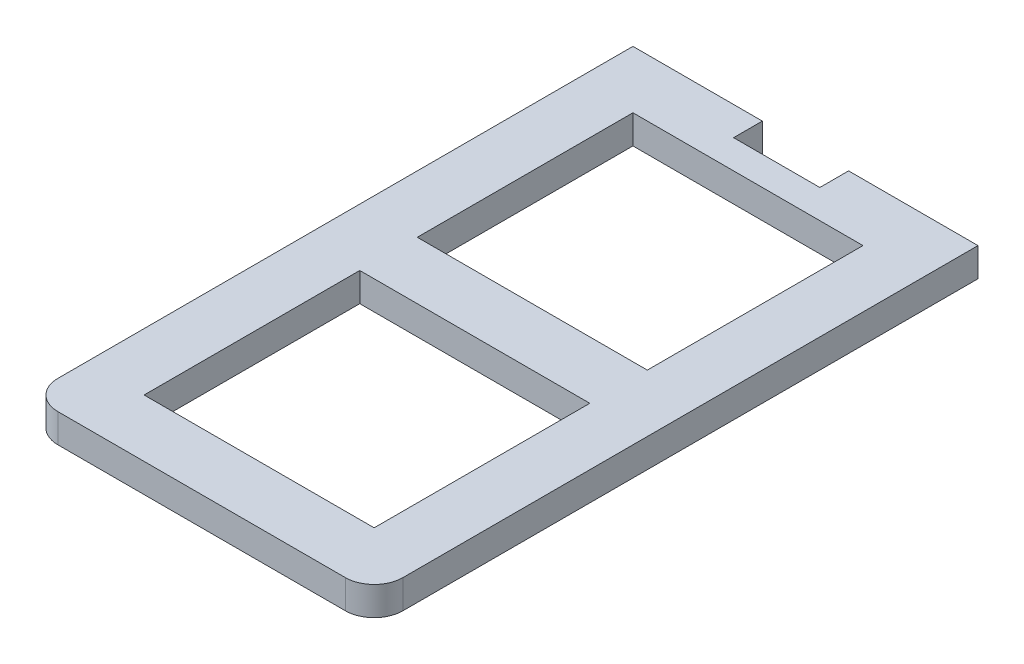
ISO-10303-21;
HEADER;
FILE_DESCRIPTION(('STEP AP214'),'2;1');
FILE_NAME('part.step','',(''),(''),'','','');
FILE_SCHEMA(('AUTOMOTIVE_DESIGN { 1 0 10303 214 1 1 1 1 }'));
ENDSEC;
DATA;
#1=APPLICATION_CONTEXT('core data for automotive mechanical design processes');
#2=APPLICATION_PROTOCOL_DEFINITION('international standard','automotive_design',2000,#1);
#3=PRODUCT_CONTEXT('',#1,'mechanical');
#4=PRODUCT('Part','Part','',(#3));
#5=PRODUCT_RELATED_PRODUCT_CATEGORY('part','',(#4));
#6=PRODUCT_DEFINITION_FORMATION('','',#4);
#7=PRODUCT_DEFINITION_CONTEXT('part definition',#1,'design');
#8=PRODUCT_DEFINITION('design','',#6,#7);
#9=PRODUCT_DEFINITION_SHAPE('','',#8);
#10=(LENGTH_UNIT() NAMED_UNIT(*) SI_UNIT(.MILLI.,.METRE.));
#11=(NAMED_UNIT(*) PLANE_ANGLE_UNIT() SI_UNIT($,.RADIAN.));
#12=(NAMED_UNIT(*) SI_UNIT($,.STERADIAN.) SOLID_ANGLE_UNIT());
#13=UNCERTAINTY_MEASURE_WITH_UNIT(LENGTH_MEASURE(1.E-05),#10,'distance_accuracy_value','');
#14=(GEOMETRIC_REPRESENTATION_CONTEXT(3) GLOBAL_UNCERTAINTY_ASSIGNED_CONTEXT((#13)) GLOBAL_UNIT_ASSIGNED_CONTEXT((#10,
#11,#12)) REPRESENTATION_CONTEXT('',''));
#15=CARTESIAN_POINT('',(0.,0.,0.));
#16=DIRECTION('',(0.,0.,1.));
#17=DIRECTION('',(1.,0.,0.));
#18=AXIS2_PLACEMENT_3D('',#15,#16,#17);
#19=CARTESIAN_POINT('',(0.,0.,0.));
#20=DIRECTION('',(0.,0.,-1.));
#21=DIRECTION('',(-1.,0.,0.));
#22=AXIS2_PLACEMENT_3D('',#19,#20,#21);
#23=PLANE('',#22);
#24=DIRECTION('',(0.,1.,0.));
#25=VECTOR('',#24,1.);
#26=CARTESIAN_POINT('',(-7.5,0.,0.));
#27=LINE('',#26,#25);
#28=CARTESIAN_POINT('',(-7.5,-2.5,0.));
#29=VERTEX_POINT('',#28);
#30=CARTESIAN_POINT('',(-7.5,2.5,0.));
#31=VERTEX_POINT('',#30);
#32=EDGE_CURVE('E11',#29,#31,#27,.T.);
#33=ORIENTED_EDGE('',*,*,#32,.F.);
#34=DIRECTION('',(1.,0.,0.));
#35=VECTOR('',#34,1.);
#36=CARTESIAN_POINT('',(-30.,-2.5,0.));
#37=LINE('',#36,#35);
#38=CARTESIAN_POINT('',(-30.,-2.5,0.));
#39=VERTEX_POINT('',#38);
#40=EDGE_CURVE('E257',#39,#29,#37,.T.);
#41=ORIENTED_EDGE('',*,*,#40,.F.);
#42=DIRECTION('',(0.,-1.,0.));
#43=VECTOR('',#42,1.);
#44=CARTESIAN_POINT('',(-30.,-2.5,0.));
#45=LINE('',#44,#43);
#46=CARTESIAN_POINT('',(-30.,2.5,0.));
#47=VERTEX_POINT('',#46);
#48=EDGE_CURVE('E267',#47,#39,#45,.T.);
#49=ORIENTED_EDGE('',*,*,#48,.F.);
#50=DIRECTION('',(-1.,0.,0.));
#51=VECTOR('',#50,1.);
#52=CARTESIAN_POINT('',(-30.,2.5,0.));
#53=LINE('',#52,#51);
#54=EDGE_CURVE('E263',#31,#47,#53,.T.);
#55=ORIENTED_EDGE('',*,*,#54,.F.);
#56=EDGE_LOOP('',(#33,#41,#49,#55));
#57=FACE_BOUND('',#56,.T.);
#58=ADVANCED_FACE('F37',(#57),#23,.T.);
#59=CARTESIAN_POINT('',(-30.,2.5,105.));
#60=DIRECTION('',(0.,-1.,0.));
#61=DIRECTION('',(0.,0.,-1.));
#62=AXIS2_PLACEMENT_3D('',#59,#60,#61);
#63=PLANE('',#62);
#64=DIRECTION('',(1.,0.,0.));
#65=VECTOR('',#64,1.);
#66=CARTESIAN_POINT('',(-30.,2.5,95.));
#67=LINE('',#66,#65);
#68=CARTESIAN_POINT('',(-20.,2.5,95.));
#69=VERTEX_POINT('',#68);
#70=CARTESIAN_POINT('',(20.,2.5,95.));
#71=VERTEX_POINT('',#70);
#72=EDGE_CURVE('E247',#69,#71,#67,.T.);
#73=ORIENTED_EDGE('',*,*,#72,.F.);
#74=DIRECTION('',(0.,0.,-1.));
#75=VECTOR('',#74,1.);
#76=CARTESIAN_POINT('',(-20.,2.5,105.));
#77=LINE('',#76,#75);
#78=CARTESIAN_POINT('',(-20.,2.5,57.5));
#79=VERTEX_POINT('',#78);
#80=EDGE_CURVE('E249',#69,#79,#77,.T.);
#81=ORIENTED_EDGE('',*,*,#80,.T.);
#82=DIRECTION('',(1.,0.,0.));
#83=VECTOR('',#82,1.);
#84=CARTESIAN_POINT('',(-30.,2.5,57.5));
#85=LINE('',#84,#83);
#86=CARTESIAN_POINT('',(20.,2.5,57.5));
#87=VERTEX_POINT('',#86);
#88=EDGE_CURVE('E241',#79,#87,#85,.T.);
#89=ORIENTED_EDGE('',*,*,#88,.T.);
#90=DIRECTION('',(0.,0.,-1.));
#91=VECTOR('',#90,1.);
#92=CARTESIAN_POINT('',(20.,2.5,105.));
#93=LINE('',#92,#91);
#94=EDGE_CURVE('E244',#71,#87,#93,.T.);
#95=ORIENTED_EDGE('',*,*,#94,.F.);
#96=EDGE_LOOP('',(#73,#81,#89,#95));
#97=FACE_BOUND('',#96,.T.);
#98=DIRECTION('',(-1.,0.,0.));
#99=VECTOR('',#98,1.);
#100=CARTESIAN_POINT('',(-30.,2.5,5.));
#101=LINE('',#100,#99);
#102=CARTESIAN_POINT('',(7.5,2.5,5.));
#103=VERTEX_POINT('',#102);
#104=CARTESIAN_POINT('',(-7.5,2.5,5.));
#105=VERTEX_POINT('',#104);
#106=EDGE_CURVE('E169',#103,#105,#101,.T.);
#107=ORIENTED_EDGE('',*,*,#106,.T.);
#108=DIRECTION('',(0.,0.,-1.));
#109=VECTOR('',#108,1.);
#110=CARTESIAN_POINT('',(-7.5,2.5,105.));
#111=LINE('',#110,#109);
#112=EDGE_CURVE('E186',#105,#31,#111,.T.);
#113=ORIENTED_EDGE('',*,*,#112,.T.);
#114=ORIENTED_EDGE('',*,*,#54,.T.);
#115=DIRECTION('',(0.,0.,-1.));
#116=VECTOR('',#115,1.);
#117=CARTESIAN_POINT('',(-30.,2.5,105.));
#118=LINE('',#117,#116);
#119=CARTESIAN_POINT('',(-30.,2.5,100.));
#120=VERTEX_POINT('',#119);
#121=EDGE_CURVE('E276',#120,#47,#118,.T.);
#122=ORIENTED_EDGE('',*,*,#121,.F.);
#123=CARTESIAN_POINT('',(-25.,2.5,100.));
#124=DIRECTION('',(0.,-1.,0.));
#125=DIRECTION('',(0.,0.,-1.));
#126=AXIS2_PLACEMENT_3D('',#123,#124,#125);
#127=CIRCLE('',#126,5.);
#128=CARTESIAN_POINT('',(-25.,2.5,105.));
#129=VERTEX_POINT('',#128);
#130=EDGE_CURVE('E287',#120,#129,#127,.F.);
#131=ORIENTED_EDGE('',*,*,#130,.T.);
#132=DIRECTION('',(-1.,0.,0.));
#133=VECTOR('',#132,1.);
#134=CARTESIAN_POINT('',(-30.,2.5,105.));
#135=LINE('',#134,#133);
#136=CARTESIAN_POINT('',(25.,2.5,105.));
#137=VERTEX_POINT('',#136);
#138=EDGE_CURVE('E253',#137,#129,#135,.T.);
#139=ORIENTED_EDGE('',*,*,#138,.F.);
#140=CARTESIAN_POINT('',(25.,2.5,100.));
#141=DIRECTION('',(0.,-1.,0.));
#142=DIRECTION('',(0.,0.,-1.));
#143=AXIS2_PLACEMENT_3D('',#140,#141,#142);
#144=CIRCLE('',#143,5.);
#145=CARTESIAN_POINT('',(30.,2.5,100.));
#146=VERTEX_POINT('',#145);
#147=EDGE_CURVE('E289',#137,#146,#144,.F.);
#148=ORIENTED_EDGE('',*,*,#147,.T.);
#149=DIRECTION('',(0.,0.,-1.));
#150=VECTOR('',#149,1.);
#151=CARTESIAN_POINT('',(30.,2.5,105.));
#152=LINE('',#151,#150);
#153=CARTESIAN_POINT('',(30.,2.5,0.));
#154=VERTEX_POINT('',#153);
#155=EDGE_CURVE('E279',#146,#154,#152,.T.);
#156=ORIENTED_EDGE('',*,*,#155,.T.);
#157=CARTESIAN_POINT('',(7.5,2.5,0.));
#158=VERTEX_POINT('',#157);
#159=EDGE_CURVE('E264',#154,#158,#53,.T.);
#160=ORIENTED_EDGE('',*,*,#159,.T.);
#161=DIRECTION('',(0.,0.,1.));
#162=VECTOR('',#161,1.);
#163=CARTESIAN_POINT('',(7.5,2.5,105.));
#164=LINE('',#163,#162);
#165=EDGE_CURVE('E52',#158,#103,#164,.T.);
#166=ORIENTED_EDGE('',*,*,#165,.T.);
#167=EDGE_LOOP('',(#107,#113,#114,#122,#131,#139,#148,#156,#160,#166));
#168=FACE_BOUND('',#167,.T.);
#169=DIRECTION('',(1.,0.,0.));
#170=VECTOR('',#169,1.);
#171=CARTESIAN_POINT('',(-30.,2.5,47.5));
#172=LINE('',#171,#170);
#173=CARTESIAN_POINT('',(-20.,2.5,47.5));
#174=VERTEX_POINT('',#173);
#175=CARTESIAN_POINT('',(20.,2.5,47.5));
#176=VERTEX_POINT('',#175);
#177=EDGE_CURVE('E239',#174,#176,#172,.T.);
#178=ORIENTED_EDGE('',*,*,#177,.F.);
#179=DIRECTION('',(0.,0.,-1.));
#180=VECTOR('',#179,1.);
#181=CARTESIAN_POINT('',(-20.,2.5,105.));
#182=LINE('',#181,#180);
#183=CARTESIAN_POINT('',(-20.,2.5,9.99999999999998));
#184=VERTEX_POINT('',#183);
#185=EDGE_CURVE('E206',#174,#184,#182,.T.);
#186=ORIENTED_EDGE('',*,*,#185,.T.);
#187=DIRECTION('',(1.,0.,0.));
#188=VECTOR('',#187,1.);
#189=CARTESIAN_POINT('',(-30.,2.5,9.99999999999998));
#190=LINE('',#189,#188);
#191=CARTESIAN_POINT('',(20.,2.5,9.99999999999998));
#192=VERTEX_POINT('',#191);
#193=EDGE_CURVE('E234',#184,#192,#190,.T.);
#194=ORIENTED_EDGE('',*,*,#193,.T.);
#195=DIRECTION('',(0.,0.,-1.));
#196=VECTOR('',#195,1.);
#197=CARTESIAN_POINT('',(20.,2.5,105.));
#198=LINE('',#197,#196);
#199=EDGE_CURVE('E237',#176,#192,#198,.T.);
#200=ORIENTED_EDGE('',*,*,#199,.F.);
#201=EDGE_LOOP('',(#178,#186,#194,#200));
#202=FACE_BOUND('',#201,.T.);
#203=ADVANCED_FACE('F305',(#97,#168,#202),#63,.F.);
#204=CARTESIAN_POINT('',(-30.,-2.5,105.));
#205=DIRECTION('',(0.,1.,0.));
#206=DIRECTION('',(0.,0.,1.));
#207=AXIS2_PLACEMENT_3D('',#204,#205,#206);
#208=PLANE('',#207);
#209=DIRECTION('',(1.,0.,0.));
#210=VECTOR('',#209,1.);
#211=CARTESIAN_POINT('',(0.,-2.5,57.5));
#212=LINE('',#211,#210);
#213=CARTESIAN_POINT('',(-20.,-2.5,57.5));
#214=VERTEX_POINT('',#213);
#215=CARTESIAN_POINT('',(20.,-2.5,57.5));
#216=VERTEX_POINT('',#215);
#217=EDGE_CURVE('E193',#214,#216,#212,.T.);
#218=ORIENTED_EDGE('',*,*,#217,.F.);
#219=DIRECTION('',(0.,0.,-1.));
#220=VECTOR('',#219,1.);
#221=CARTESIAN_POINT('',(-20.,-2.5,0.));
#222=LINE('',#221,#220);
#223=CARTESIAN_POINT('',(-20.,-2.5,95.));
#224=VERTEX_POINT('',#223);
#225=EDGE_CURVE('E191',#224,#214,#222,.T.);
#226=ORIENTED_EDGE('',*,*,#225,.F.);
#227=DIRECTION('',(1.,0.,0.));
#228=VECTOR('',#227,1.);
#229=CARTESIAN_POINT('',(0.,-2.5,95.));
#230=LINE('',#229,#228);
#231=CARTESIAN_POINT('',(20.,-2.5,95.));
#232=VERTEX_POINT('',#231);
#233=EDGE_CURVE('E200',#224,#232,#230,.T.);
#234=ORIENTED_EDGE('',*,*,#233,.T.);
#235=DIRECTION('',(0.,0.,-1.));
#236=VECTOR('',#235,1.);
#237=CARTESIAN_POINT('',(20.,-2.5,0.));
#238=LINE('',#237,#236);
#239=EDGE_CURVE('E197',#232,#216,#238,.T.);
#240=ORIENTED_EDGE('',*,*,#239,.T.);
#241=EDGE_LOOP('',(#218,#226,#234,#240));
#242=FACE_BOUND('',#241,.T.);
#243=ORIENTED_EDGE('',*,*,#40,.T.);
#244=DIRECTION('',(0.,0.,-1.));
#245=VECTOR('',#244,1.);
#246=CARTESIAN_POINT('',(-7.5,-2.5,-5.));
#247=LINE('',#246,#245);
#248=CARTESIAN_POINT('',(-7.5,-2.5,5.));
#249=VERTEX_POINT('',#248);
#250=EDGE_CURVE('E176',#249,#29,#247,.T.);
#251=ORIENTED_EDGE('',*,*,#250,.F.);
#252=DIRECTION('',(-1.,0.,0.));
#253=VECTOR('',#252,1.);
#254=CARTESIAN_POINT('',(7.5,-2.5,5.));
#255=LINE('',#254,#253);
#256=CARTESIAN_POINT('',(7.5,-2.5,5.));
#257=VERTEX_POINT('',#256);
#258=EDGE_CURVE('E166',#257,#249,#255,.T.);
#259=ORIENTED_EDGE('',*,*,#258,.F.);
#260=DIRECTION('',(0.,0.,1.));
#261=VECTOR('',#260,1.);
#262=CARTESIAN_POINT('',(7.5,-2.5,-5.));
#263=LINE('',#262,#261);
#264=CARTESIAN_POINT('',(7.5,-2.5,0.));
#265=VERTEX_POINT('',#264);
#266=EDGE_CURVE('E173',#265,#257,#263,.T.);
#267=ORIENTED_EDGE('',*,*,#266,.F.);
#268=CARTESIAN_POINT('',(30.,-2.5,0.));
#269=VERTEX_POINT('',#268);
#270=EDGE_CURVE('E270',#265,#269,#37,.T.);
#271=ORIENTED_EDGE('',*,*,#270,.T.);
#272=DIRECTION('',(0.,0.,-1.));
#273=VECTOR('',#272,1.);
#274=CARTESIAN_POINT('',(30.,-2.5,105.));
#275=LINE('',#274,#273);
#276=CARTESIAN_POINT('',(30.,-2.5,100.));
#277=VERTEX_POINT('',#276);
#278=EDGE_CURVE('E260',#277,#269,#275,.T.);
#279=ORIENTED_EDGE('',*,*,#278,.F.);
#280=CARTESIAN_POINT('',(25.,-2.5,100.));
#281=DIRECTION('',(0.,1.,0.));
#282=DIRECTION('',(0.,0.,1.));
#283=AXIS2_PLACEMENT_3D('',#280,#281,#282);
#284=CIRCLE('',#283,5.);
#285=CARTESIAN_POINT('',(25.,-2.5,105.));
#286=VERTEX_POINT('',#285);
#287=EDGE_CURVE('E294',#277,#286,#284,.F.);
#288=ORIENTED_EDGE('',*,*,#287,.T.);
#289=DIRECTION('',(1.,0.,0.));
#290=VECTOR('',#289,1.);
#291=CARTESIAN_POINT('',(-30.,-2.5,105.));
#292=LINE('',#291,#290);
#293=CARTESIAN_POINT('',(-25.,-2.5,105.));
#294=VERTEX_POINT('',#293);
#295=EDGE_CURVE('E256',#294,#286,#292,.T.);
#296=ORIENTED_EDGE('',*,*,#295,.F.);
#297=CARTESIAN_POINT('',(-25.,-2.5,100.));
#298=DIRECTION('',(0.,1.,0.));
#299=DIRECTION('',(0.,0.,1.));
#300=AXIS2_PLACEMENT_3D('',#297,#298,#299);
#301=CIRCLE('',#300,5.);
#302=CARTESIAN_POINT('',(-30.,-2.5,100.));
#303=VERTEX_POINT('',#302);
#304=EDGE_CURVE('E60',#294,#303,#301,.F.);
#305=ORIENTED_EDGE('',*,*,#304,.T.);
#306=DIRECTION('',(0.,0.,-1.));
#307=VECTOR('',#306,1.);
#308=CARTESIAN_POINT('',(-30.,-2.5,105.));
#309=LINE('',#308,#307);
#310=EDGE_CURVE('E274',#303,#39,#309,.T.);
#311=ORIENTED_EDGE('',*,*,#310,.T.);
#312=EDGE_LOOP('',(#243,#251,#259,#267,#271,#279,#288,#296,#305,#311));
#313=FACE_BOUND('',#312,.T.);
#314=DIRECTION('',(1.,0.,0.));
#315=VECTOR('',#314,1.);
#316=CARTESIAN_POINT('',(0.,-2.5,47.5));
#317=LINE('',#316,#315);
#318=CARTESIAN_POINT('',(-20.,-2.5,47.5));
#319=VERTEX_POINT('',#318);
#320=CARTESIAN_POINT('',(20.,-2.5,47.5));
#321=VERTEX_POINT('',#320);
#322=EDGE_CURVE('E190',#319,#321,#317,.T.);
#323=ORIENTED_EDGE('',*,*,#322,.T.);
#324=DIRECTION('',(0.,0.,-1.));
#325=VECTOR('',#324,1.);
#326=CARTESIAN_POINT('',(20.,-2.5,0.));
#327=LINE('',#326,#325);
#328=CARTESIAN_POINT('',(20.,-2.5,9.99999999999998));
#329=VERTEX_POINT('',#328);
#330=EDGE_CURVE('E221',#321,#329,#327,.T.);
#331=ORIENTED_EDGE('',*,*,#330,.T.);
#332=DIRECTION('',(1.,0.,0.));
#333=VECTOR('',#332,1.);
#334=CARTESIAN_POINT('',(0.,-2.5,9.99999999999998));
#335=LINE('',#334,#333);
#336=CARTESIAN_POINT('',(-20.,-2.5,9.99999999999997));
#337=VERTEX_POINT('',#336);
#338=EDGE_CURVE('E218',#337,#329,#335,.T.);
#339=ORIENTED_EDGE('',*,*,#338,.F.);
#340=DIRECTION('',(0.,0.,-1.));
#341=VECTOR('',#340,1.);
#342=CARTESIAN_POINT('',(-20.,-2.5,0.));
#343=LINE('',#342,#341);
#344=EDGE_CURVE('E215',#319,#337,#343,.T.);
#345=ORIENTED_EDGE('',*,*,#344,.F.);
#346=EDGE_LOOP('',(#323,#331,#339,#345));
#347=FACE_BOUND('',#346,.T.);
#348=ADVANCED_FACE('F179',(#242,#313,#347),#208,.F.);
#349=CARTESIAN_POINT('',(30.,-2.5,105.));
#350=DIRECTION('',(-1.,0.,0.));
#351=DIRECTION('',(0.,0.,1.));
#352=AXIS2_PLACEMENT_3D('',#349,#350,#351);
#353=PLANE('',#352);
#354=ORIENTED_EDGE('',*,*,#155,.F.);
#355=DIRECTION('',(0.,1.,0.));
#356=VECTOR('',#355,1.);
#357=CARTESIAN_POINT('',(30.,-2.5,100.));
#358=LINE('',#357,#356);
#359=EDGE_CURVE('E291',#146,#277,#358,.F.);
#360=ORIENTED_EDGE('',*,*,#359,.T.);
#361=ORIENTED_EDGE('',*,*,#278,.T.);
#362=DIRECTION('',(0.,1.,0.));
#363=VECTOR('',#362,1.);
#364=CARTESIAN_POINT('',(30.,-2.5,0.));
#365=LINE('',#364,#363);
#366=EDGE_CURVE('E252',#269,#154,#365,.T.);
#367=ORIENTED_EDGE('',*,*,#366,.T.);
#368=EDGE_LOOP('',(#354,#360,#361,#367));
#369=FACE_BOUND('',#368,.T.);
#370=ADVANCED_FACE('F321',(#369),#353,.F.);
#371=CARTESIAN_POINT('',(-30.,-2.5,105.));
#372=DIRECTION('',(1.,0.,0.));
#373=DIRECTION('',(0.,0.,-1.));
#374=AXIS2_PLACEMENT_3D('',#371,#372,#373);
#375=PLANE('',#374);
#376=ORIENTED_EDGE('',*,*,#310,.F.);
#377=DIRECTION('',(0.,-1.,0.));
#378=VECTOR('',#377,1.);
#379=CARTESIAN_POINT('',(-30.,-2.5,100.));
#380=LINE('',#379,#378);
#381=EDGE_CURVE('E296',#303,#120,#380,.F.);
#382=ORIENTED_EDGE('',*,*,#381,.T.);
#383=ORIENTED_EDGE('',*,*,#121,.T.);
#384=ORIENTED_EDGE('',*,*,#48,.T.);
#385=EDGE_LOOP('',(#376,#382,#383,#384));
#386=FACE_BOUND('',#385,.T.);
#387=ADVANCED_FACE('F300',(#386),#375,.F.);
#388=CARTESIAN_POINT('',(0.,0.,105.));
#389=DIRECTION('',(0.,0.,-1.));
#390=DIRECTION('',(-1.,0.,0.));
#391=AXIS2_PLACEMENT_3D('',#388,#389,#390);
#392=PLANE('',#391);
#393=ORIENTED_EDGE('',*,*,#295,.T.);
#394=DIRECTION('',(0.,1.,0.));
#395=VECTOR('',#394,1.);
#396=CARTESIAN_POINT('',(25.,0.,105.));
#397=LINE('',#396,#395);
#398=EDGE_CURVE('E284',#286,#137,#397,.T.);
#399=ORIENTED_EDGE('',*,*,#398,.T.);
#400=ORIENTED_EDGE('',*,*,#138,.T.);
#401=DIRECTION('',(0.,-1.,0.));
#402=VECTOR('',#401,1.);
#403=CARTESIAN_POINT('',(-25.,0.,105.));
#404=LINE('',#403,#402);
#405=EDGE_CURVE('E281',#129,#294,#404,.T.);
#406=ORIENTED_EDGE('',*,*,#405,.T.);
#407=EDGE_LOOP('',(#393,#399,#400,#406));
#408=FACE_BOUND('',#407,.T.);
#409=ADVANCED_FACE('F311',(#408),#392,.F.);
#410=DIRECTION('',(0.,-1.,0.));
#411=VECTOR('',#410,1.);
#412=CARTESIAN_POINT('',(7.5,0.,0.));
#413=LINE('',#412,#411);
#414=EDGE_CURVE('E45',#158,#265,#413,.T.);
#415=ORIENTED_EDGE('',*,*,#414,.F.);
#416=ORIENTED_EDGE('',*,*,#159,.F.);
#417=ORIENTED_EDGE('',*,*,#366,.F.);
#418=ORIENTED_EDGE('',*,*,#270,.F.);
#419=EDGE_LOOP('',(#415,#416,#417,#418));
#420=FACE_BOUND('',#419,.T.);
#421=ADVANCED_FACE('F324',(#420),#23,.T.);
#422=CARTESIAN_POINT('',(0.,102.5,47.5));
#423=DIRECTION('',(0.,0.,-1.));
#424=DIRECTION('',(-1.,0.,0.));
#425=AXIS2_PLACEMENT_3D('',#422,#423,#424);
#426=PLANE('',#425);
#427=ORIENTED_EDGE('',*,*,#177,.T.);
#428=DIRECTION('',(0.,-1.,0.));
#429=VECTOR('',#428,1.);
#430=CARTESIAN_POINT('',(20.,102.5,47.5));
#431=LINE('',#430,#429);
#432=EDGE_CURVE('E194',#176,#321,#431,.T.);
#433=ORIENTED_EDGE('',*,*,#432,.T.);
#434=ORIENTED_EDGE('',*,*,#322,.F.);
#435=DIRECTION('',(0.,-1.,0.));
#436=VECTOR('',#435,1.);
#437=CARTESIAN_POINT('',(-20.,102.5,47.5));
#438=LINE('',#437,#436);
#439=EDGE_CURVE('E224',#174,#319,#438,.T.);
#440=ORIENTED_EDGE('',*,*,#439,.F.);
#441=EDGE_LOOP('',(#427,#433,#434,#440));
#442=FACE_BOUND('',#441,.T.);
#443=ADVANCED_FACE('F350',(#442),#426,.T.);
#444=CARTESIAN_POINT('',(20.,102.5,0.));
#445=DIRECTION('',(-1.,0.,0.));
#446=DIRECTION('',(0.,0.,1.));
#447=AXIS2_PLACEMENT_3D('',#444,#445,#446);
#448=PLANE('',#447);
#449=ORIENTED_EDGE('',*,*,#199,.T.);
#450=DIRECTION('',(0.,-1.,0.));
#451=VECTOR('',#450,1.);
#452=CARTESIAN_POINT('',(20.,102.5,9.99999999999998));
#453=LINE('',#452,#451);
#454=EDGE_CURVE('E226',#192,#329,#453,.T.);
#455=ORIENTED_EDGE('',*,*,#454,.T.);
#456=ORIENTED_EDGE('',*,*,#330,.F.);
#457=ORIENTED_EDGE('',*,*,#432,.F.);
#458=EDGE_LOOP('',(#449,#455,#456,#457));
#459=FACE_BOUND('',#458,.T.);
#460=ADVANCED_FACE('F356',(#459),#448,.T.);
#461=CARTESIAN_POINT('',(0.,102.5,9.99999999999998));
#462=DIRECTION('',(0.,0.,-1.));
#463=DIRECTION('',(-1.,0.,0.));
#464=AXIS2_PLACEMENT_3D('',#461,#462,#463);
#465=PLANE('',#464);
#466=DIRECTION('',(0.,-1.,0.));
#467=VECTOR('',#466,1.);
#468=CARTESIAN_POINT('',(-20.,102.5,9.99999999999997));
#469=LINE('',#468,#467);
#470=EDGE_CURVE('E228',#184,#337,#469,.T.);
#471=ORIENTED_EDGE('',*,*,#470,.T.);
#472=ORIENTED_EDGE('',*,*,#338,.T.);
#473=ORIENTED_EDGE('',*,*,#454,.F.);
#474=ORIENTED_EDGE('',*,*,#193,.F.);
#475=EDGE_LOOP('',(#471,#472,#473,#474));
#476=FACE_BOUND('',#475,.T.);
#477=ADVANCED_FACE('F370',(#476),#465,.F.);
#478=CARTESIAN_POINT('',(-20.,102.5,0.));
#479=DIRECTION('',(-1.,0.,0.));
#480=DIRECTION('',(0.,0.,1.));
#481=AXIS2_PLACEMENT_3D('',#478,#479,#480);
#482=PLANE('',#481);
#483=ORIENTED_EDGE('',*,*,#439,.T.);
#484=ORIENTED_EDGE('',*,*,#344,.T.);
#485=ORIENTED_EDGE('',*,*,#470,.F.);
#486=ORIENTED_EDGE('',*,*,#185,.F.);
#487=EDGE_LOOP('',(#483,#484,#485,#486));
#488=FACE_BOUND('',#487,.T.);
#489=ADVANCED_FACE('F366',(#488),#482,.F.);
#490=CARTESIAN_POINT('',(-20.,102.5,0.));
#491=DIRECTION('',(-1.,0.,0.));
#492=DIRECTION('',(0.,0.,1.));
#493=AXIS2_PLACEMENT_3D('',#490,#491,#492);
#494=PLANE('',#493);
#495=DIRECTION('',(0.,-1.,0.));
#496=VECTOR('',#495,1.);
#497=CARTESIAN_POINT('',(-20.,102.5,95.));
#498=LINE('',#497,#496);
#499=EDGE_CURVE('E204',#69,#224,#498,.T.);
#500=ORIENTED_EDGE('',*,*,#499,.T.);
#501=ORIENTED_EDGE('',*,*,#225,.T.);
#502=DIRECTION('',(0.,-1.,0.));
#503=VECTOR('',#502,1.);
#504=CARTESIAN_POINT('',(-20.,102.5,57.5));
#505=LINE('',#504,#503);
#506=EDGE_CURVE('E203',#79,#214,#505,.T.);
#507=ORIENTED_EDGE('',*,*,#506,.F.);
#508=ORIENTED_EDGE('',*,*,#80,.F.);
#509=EDGE_LOOP('',(#500,#501,#507,#508));
#510=FACE_BOUND('',#509,.T.);
#511=ADVANCED_FACE('F369',(#510),#494,.F.);
#512=CARTESIAN_POINT('',(0.,102.5,95.));
#513=DIRECTION('',(0.,0.,-1.));
#514=DIRECTION('',(-1.,0.,0.));
#515=AXIS2_PLACEMENT_3D('',#512,#513,#514);
#516=PLANE('',#515);
#517=ORIENTED_EDGE('',*,*,#72,.T.);
#518=DIRECTION('',(0.,-1.,0.));
#519=VECTOR('',#518,1.);
#520=CARTESIAN_POINT('',(20.,102.5,95.));
#521=LINE('',#520,#519);
#522=EDGE_CURVE('E207',#71,#232,#521,.T.);
#523=ORIENTED_EDGE('',*,*,#522,.T.);
#524=ORIENTED_EDGE('',*,*,#233,.F.);
#525=ORIENTED_EDGE('',*,*,#499,.F.);
#526=EDGE_LOOP('',(#517,#523,#524,#525));
#527=FACE_BOUND('',#526,.T.);
#528=ADVANCED_FACE('F380',(#527),#516,.T.);
#529=CARTESIAN_POINT('',(20.,102.5,0.));
#530=DIRECTION('',(-1.,0.,0.));
#531=DIRECTION('',(0.,0.,1.));
#532=AXIS2_PLACEMENT_3D('',#529,#530,#531);
#533=PLANE('',#532);
#534=ORIENTED_EDGE('',*,*,#94,.T.);
#535=DIRECTION('',(0.,-1.,0.));
#536=VECTOR('',#535,1.);
#537=CARTESIAN_POINT('',(20.,102.5,57.5));
#538=LINE('',#537,#536);
#539=EDGE_CURVE('E209',#87,#216,#538,.T.);
#540=ORIENTED_EDGE('',*,*,#539,.T.);
#541=ORIENTED_EDGE('',*,*,#239,.F.);
#542=ORIENTED_EDGE('',*,*,#522,.F.);
#543=EDGE_LOOP('',(#534,#540,#541,#542));
#544=FACE_BOUND('',#543,.T.);
#545=ADVANCED_FACE('F385',(#544),#533,.T.);
#546=CARTESIAN_POINT('',(0.,102.5,57.5));
#547=DIRECTION('',(0.,0.,-1.));
#548=DIRECTION('',(-1.,0.,0.));
#549=AXIS2_PLACEMENT_3D('',#546,#547,#548);
#550=PLANE('',#549);
#551=ORIENTED_EDGE('',*,*,#506,.T.);
#552=ORIENTED_EDGE('',*,*,#217,.T.);
#553=ORIENTED_EDGE('',*,*,#539,.F.);
#554=ORIENTED_EDGE('',*,*,#88,.F.);
#555=EDGE_LOOP('',(#551,#552,#553,#554));
#556=FACE_BOUND('',#555,.T.);
#557=ADVANCED_FACE('F382',(#556),#550,.F.);
#558=CARTESIAN_POINT('',(25.,0.,100.));
#559=DIRECTION('',(0.,1.,0.));
#560=DIRECTION('',(0.,0.,1.));
#561=AXIS2_PLACEMENT_3D('',#558,#559,#560);
#562=CYLINDRICAL_SURFACE('',#561,5.);
#563=ORIENTED_EDGE('',*,*,#287,.F.);
#564=ORIENTED_EDGE('',*,*,#359,.F.);
#565=ORIENTED_EDGE('',*,*,#147,.F.);
#566=ORIENTED_EDGE('',*,*,#398,.F.);
#567=EDGE_LOOP('',(#563,#564,#565,#566));
#568=FACE_BOUND('',#567,.T.);
#569=ADVANCED_FACE('F317',(#568),#562,.T.);
#570=CARTESIAN_POINT('',(-25.,0.,100.));
#571=DIRECTION('',(0.,-1.,0.));
#572=DIRECTION('',(0.,0.,-1.));
#573=AXIS2_PLACEMENT_3D('',#570,#571,#572);
#574=CYLINDRICAL_SURFACE('',#573,5.);
#575=ORIENTED_EDGE('',*,*,#130,.F.);
#576=ORIENTED_EDGE('',*,*,#381,.F.);
#577=ORIENTED_EDGE('',*,*,#304,.F.);
#578=ORIENTED_EDGE('',*,*,#405,.F.);
#579=EDGE_LOOP('',(#575,#576,#577,#578));
#580=FACE_BOUND('',#579,.T.);
#581=ADVANCED_FACE('F39',(#580),#574,.T.);
#582=CARTESIAN_POINT('',(7.5,7.5,5.));
#583=DIRECTION('',(0.,0.,1.));
#584=DIRECTION('',(1.,0.,0.));
#585=AXIS2_PLACEMENT_3D('',#582,#583,#584);
#586=PLANE('',#585);
#587=DIRECTION('',(0.,-1.,0.));
#588=VECTOR('',#587,1.);
#589=CARTESIAN_POINT('',(7.5,7.5,5.));
#590=LINE('',#589,#588);
#591=EDGE_CURVE('E161',#103,#257,#590,.T.);
#592=ORIENTED_EDGE('',*,*,#591,.T.);
#593=ORIENTED_EDGE('',*,*,#258,.T.);
#594=DIRECTION('',(0.,-1.,0.));
#595=VECTOR('',#594,1.);
#596=CARTESIAN_POINT('',(-7.5,7.5,5.));
#597=LINE('',#596,#595);
#598=EDGE_CURVE('E170',#105,#249,#597,.T.);
#599=ORIENTED_EDGE('',*,*,#598,.F.);
#600=ORIENTED_EDGE('',*,*,#106,.F.);
#601=EDGE_LOOP('',(#592,#593,#599,#600));
#602=FACE_BOUND('',#601,.T.);
#603=ADVANCED_FACE('F163',(#602),#586,.F.);
#604=CARTESIAN_POINT('',(-7.5,7.5,-5.));
#605=DIRECTION('',(-1.,0.,0.));
#606=DIRECTION('',(0.,0.,1.));
#607=AXIS2_PLACEMENT_3D('',#604,#605,#606);
#608=PLANE('',#607);
#609=ORIENTED_EDGE('',*,*,#598,.T.);
#610=ORIENTED_EDGE('',*,*,#250,.T.);
#611=ORIENTED_EDGE('',*,*,#32,.T.);
#612=ORIENTED_EDGE('',*,*,#112,.F.);
#613=EDGE_LOOP('',(#609,#610,#611,#612));
#614=FACE_BOUND('',#613,.T.);
#615=ADVANCED_FACE('F329',(#614),#608,.F.);
#616=CARTESIAN_POINT('',(7.5,7.5,-5.));
#617=DIRECTION('',(1.,0.,0.));
#618=DIRECTION('',(0.,0.,-1.));
#619=AXIS2_PLACEMENT_3D('',#616,#617,#618);
#620=PLANE('',#619);
#621=ORIENTED_EDGE('',*,*,#414,.T.);
#622=ORIENTED_EDGE('',*,*,#266,.T.);
#623=ORIENTED_EDGE('',*,*,#591,.F.);
#624=ORIENTED_EDGE('',*,*,#165,.F.);
#625=EDGE_LOOP('',(#621,#622,#623,#624));
#626=FACE_BOUND('',#625,.T.);
#627=ADVANCED_FACE('F174',(#626),#620,.F.);
#628=CLOSED_SHELL('',(#58,#203,#348,#370,#387,#409,#421,#443,#460,#477,#489,#511,#528,#545,#557,
#569,#581,#603,#615,#627));
#629=MANIFOLD_SOLID_BREP('B2',#628);
#630=ADVANCED_BREP_SHAPE_REPRESENTATION('',(#18,#629),#14);
#631=SHAPE_DEFINITION_REPRESENTATION(#9,#630);
ENDSEC;
END-ISO-10303-21;
